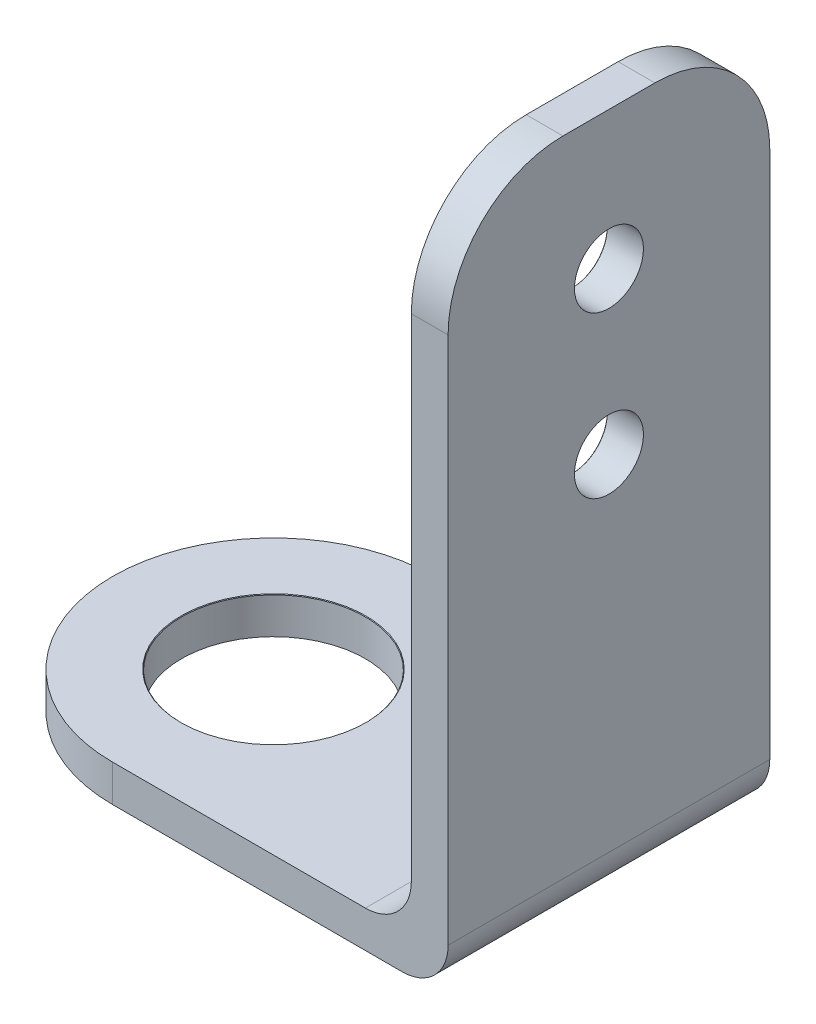
ISO-10303-21;
HEADER;
FILE_DESCRIPTION(('STEP AP214'),'2;1');
FILE_NAME('part.step','',(''),(''),'','','');
FILE_SCHEMA(('AUTOMOTIVE_DESIGN { 1 0 10303 214 1 1 1 1 }'));
ENDSEC;
DATA;
#1=APPLICATION_CONTEXT('core data for automotive mechanical design processes');
#2=APPLICATION_PROTOCOL_DEFINITION('international standard','automotive_design',2000,#1);
#3=PRODUCT_CONTEXT('',#1,'mechanical');
#4=PRODUCT('Part','Part','',(#3));
#5=PRODUCT_RELATED_PRODUCT_CATEGORY('part','',(#4));
#6=PRODUCT_DEFINITION_FORMATION('','',#4);
#7=PRODUCT_DEFINITION_CONTEXT('part definition',#1,'design');
#8=PRODUCT_DEFINITION('design','',#6,#7);
#9=PRODUCT_DEFINITION_SHAPE('','',#8);
#10=(LENGTH_UNIT() NAMED_UNIT(*) SI_UNIT(.MILLI.,.METRE.));
#11=(NAMED_UNIT(*) PLANE_ANGLE_UNIT() SI_UNIT($,.RADIAN.));
#12=(NAMED_UNIT(*) SI_UNIT($,.STERADIAN.) SOLID_ANGLE_UNIT());
#13=UNCERTAINTY_MEASURE_WITH_UNIT(LENGTH_MEASURE(1.E-05),#10,'distance_accuracy_value','');
#14=(GEOMETRIC_REPRESENTATION_CONTEXT(3) GLOBAL_UNCERTAINTY_ASSIGNED_CONTEXT((#13)) GLOBAL_UNIT_ASSIGNED_CONTEXT((#10,
#11,#12)) REPRESENTATION_CONTEXT('',''));
#15=CARTESIAN_POINT('',(0.,0.,0.));
#16=DIRECTION('',(0.,0.,1.));
#17=DIRECTION('',(1.,0.,0.));
#18=AXIS2_PLACEMENT_3D('',#15,#16,#17);
#19=CARTESIAN_POINT('',(7.,1.6,7.));
#20=DIRECTION('',(0.,-1.,0.));
#21=DIRECTION('',(1.,0.,0.));
#22=AXIS2_PLACEMENT_3D('',#19,#20,#21);
#23=CYLINDRICAL_SURFACE('',#22,7.);
#24=DIRECTION('',(0.,1.,0.));
#25=VECTOR('',#24,1.);
#26=CARTESIAN_POINT('',(7.,1.6,14.));
#27=LINE('',#26,#25);
#28=CARTESIAN_POINT('',(7.,1.6,14.));
#29=VERTEX_POINT('',#28);
#30=CARTESIAN_POINT('',(7.,0.,14.));
#31=VERTEX_POINT('',#30);
#32=EDGE_CURVE('E122',#29,#31,#27,.F.);
#33=ORIENTED_EDGE('',*,*,#32,.F.);
#34=CARTESIAN_POINT('',(7.,1.6,7.));
#35=DIRECTION('',(0.,-1.,0.));
#36=DIRECTION('',(1.,0.,0.));
#37=AXIS2_PLACEMENT_3D('',#34,#35,#36);
#38=CIRCLE('',#37,7.);
#39=CARTESIAN_POINT('',(7.,1.6,0.));
#40=VERTEX_POINT('',#39);
#41=EDGE_CURVE('E127',#40,#29,#38,.F.);
#42=ORIENTED_EDGE('',*,*,#41,.F.);
#43=DIRECTION('',(0.,-1.,0.));
#44=VECTOR('',#43,1.);
#45=CARTESIAN_POINT('',(7.,0.,0.));
#46=LINE('',#45,#44);
#47=CARTESIAN_POINT('',(7.,0.,0.));
#48=VERTEX_POINT('',#47);
#49=EDGE_CURVE('E124',#48,#40,#46,.F.);
#50=ORIENTED_EDGE('',*,*,#49,.F.);
#51=CARTESIAN_POINT('',(7.,0.,7.));
#52=DIRECTION('',(0.,1.,0.));
#53=DIRECTION('',(0.,0.,1.));
#54=AXIS2_PLACEMENT_3D('',#51,#52,#53);
#55=CIRCLE('',#54,7.);
#56=EDGE_CURVE('E119',#31,#48,#55,.F.);
#57=ORIENTED_EDGE('',*,*,#56,.F.);
#58=EDGE_LOOP('',(#33,#42,#50,#57));
#59=FACE_BOUND('',#58,.T.);
#60=ADVANCED_FACE('F40',(#59),#23,.T.);
#61=CARTESIAN_POINT('',(0.,0.,14.));
#62=DIRECTION('',(0.,1.,0.));
#63=DIRECTION('',(0.,0.,1.));
#64=AXIS2_PLACEMENT_3D('',#61,#62,#63);
#65=PLANE('',#64);
#66=CARTESIAN_POINT('',(7.,0.,7.));
#67=DIRECTION('',(0.,1.,0.));
#68=DIRECTION('',(0.,0.,1.));
#69=AXIS2_PLACEMENT_3D('',#66,#67,#68);
#70=CIRCLE('',#69,3.99999999999999);
#71=CARTESIAN_POINT('',(7.,0.,11.));
#72=VERTEX_POINT('',#71);
#73=EDGE_CURVE('E164',#72,#72,#70,.T.);
#74=ORIENTED_EDGE('',*,*,#73,.T.);
#75=EDGE_LOOP('',(#74));
#76=FACE_BOUND('',#75,.T.);
#77=DIRECTION('',(1.,0.,0.));
#78=VECTOR('',#77,1.);
#79=CARTESIAN_POINT('',(0.,0.,0.));
#80=LINE('',#79,#78);
#81=CARTESIAN_POINT('',(19.6,0.,0.));
#82=VERTEX_POINT('',#81);
#83=EDGE_CURVE('E160',#48,#82,#80,.T.);
#84=ORIENTED_EDGE('',*,*,#83,.T.);
#85=DIRECTION('',(0.,0.,-1.));
#86=VECTOR('',#85,1.);
#87=CARTESIAN_POINT('',(19.6,0.,14.));
#88=LINE('',#87,#86);
#89=CARTESIAN_POINT('',(19.6,0.,14.));
#90=VERTEX_POINT('',#89);
#91=EDGE_CURVE('E56',#82,#90,#88,.F.);
#92=ORIENTED_EDGE('',*,*,#91,.T.);
#93=DIRECTION('',(1.,0.,0.));
#94=VECTOR('',#93,1.);
#95=CARTESIAN_POINT('',(0.,0.,14.));
#96=LINE('',#95,#94);
#97=EDGE_CURVE('E131',#31,#90,#96,.T.);
#98=ORIENTED_EDGE('',*,*,#97,.F.);
#99=ORIENTED_EDGE('',*,*,#56,.T.);
#100=EDGE_LOOP('',(#84,#92,#98,#99));
#101=FACE_BOUND('',#100,.T.);
#102=ADVANCED_FACE('F139',(#76,#101),#65,.F.);
#103=CARTESIAN_POINT('',(21.6,0.,14.));
#104=DIRECTION('',(-1.,0.,0.));
#105=DIRECTION('',(0.,0.,1.));
#106=AXIS2_PLACEMENT_3D('',#103,#104,#105);
#107=PLANE('',#106);
#108=CARTESIAN_POINT('',(21.6,24.,7.));
#109=DIRECTION('',(-1.,0.,0.));
#110=DIRECTION('',(0.,0.,1.));
#111=AXIS2_PLACEMENT_3D('',#108,#109,#110);
#112=CIRCLE('',#111,1.5);
#113=CARTESIAN_POINT('',(21.6,24.,8.5));
#114=VERTEX_POINT('',#113);
#115=EDGE_CURVE('E189',#114,#114,#112,.T.);
#116=ORIENTED_EDGE('',*,*,#115,.T.);
#117=EDGE_LOOP('',(#116));
#118=FACE_BOUND('',#117,.T.);
#119=CARTESIAN_POINT('',(21.6,17.,7.));
#120=DIRECTION('',(-1.,0.,0.));
#121=DIRECTION('',(0.,0.,1.));
#122=AXIS2_PLACEMENT_3D('',#119,#120,#121);
#123=CIRCLE('',#122,1.5);
#124=CARTESIAN_POINT('',(21.6,17.,8.5));
#125=VERTEX_POINT('',#124);
#126=EDGE_CURVE('E183',#125,#125,#123,.T.);
#127=ORIENTED_EDGE('',*,*,#126,.T.);
#128=EDGE_LOOP('',(#127));
#129=FACE_BOUND('',#128,.T.);
#130=DIRECTION('',(0.,1.,0.));
#131=VECTOR('',#130,1.);
#132=CARTESIAN_POINT('',(21.6,0.,14.));
#133=LINE('',#132,#131);
#134=CARTESIAN_POINT('',(21.6,2.,14.));
#135=VERTEX_POINT('',#134);
#136=CARTESIAN_POINT('',(21.6,25.,14.));
#137=VERTEX_POINT('',#136);
#138=EDGE_CURVE('E141',#135,#137,#133,.T.);
#139=ORIENTED_EDGE('',*,*,#138,.F.);
#140=DIRECTION('',(0.,0.,-1.));
#141=VECTOR('',#140,1.);
#142=CARTESIAN_POINT('',(21.6,2.,14.));
#143=LINE('',#142,#141);
#144=CARTESIAN_POINT('',(21.6,2.,0.));
#145=VERTEX_POINT('',#144);
#146=EDGE_CURVE('E229',#135,#145,#143,.T.);
#147=ORIENTED_EDGE('',*,*,#146,.T.);
#148=DIRECTION('',(0.,1.,0.));
#149=VECTOR('',#148,1.);
#150=CARTESIAN_POINT('',(21.6,0.,0.));
#151=LINE('',#150,#149);
#152=CARTESIAN_POINT('',(21.6,25.,0.));
#153=VERTEX_POINT('',#152);
#154=EDGE_CURVE('E163',#145,#153,#151,.T.);
#155=ORIENTED_EDGE('',*,*,#154,.T.);
#156=CARTESIAN_POINT('',(21.6,25.,5.));
#157=DIRECTION('',(-1.,0.,0.));
#158=DIRECTION('',(0.,0.,1.));
#159=AXIS2_PLACEMENT_3D('',#156,#157,#158);
#160=CIRCLE('',#159,5.);
#161=CARTESIAN_POINT('',(21.6,30.,5.));
#162=VERTEX_POINT('',#161);
#163=EDGE_CURVE('E215',#153,#162,#160,.F.);
#164=ORIENTED_EDGE('',*,*,#163,.T.);
#165=DIRECTION('',(0.,0.,-1.));
#166=VECTOR('',#165,1.);
#167=CARTESIAN_POINT('',(21.6,30.,14.));
#168=LINE('',#167,#166);
#169=CARTESIAN_POINT('',(21.6,30.,9.));
#170=VERTEX_POINT('',#169);
#171=EDGE_CURVE('E137',#170,#162,#168,.T.);
#172=ORIENTED_EDGE('',*,*,#171,.F.);
#173=CARTESIAN_POINT('',(21.6,25.,9.));
#174=DIRECTION('',(-1.,0.,0.));
#175=DIRECTION('',(0.,0.,1.));
#176=AXIS2_PLACEMENT_3D('',#173,#174,#175);
#177=CIRCLE('',#176,5.);
#178=EDGE_CURVE('E211',#170,#137,#177,.F.);
#179=ORIENTED_EDGE('',*,*,#178,.T.);
#180=EDGE_LOOP('',(#139,#147,#155,#164,#172,#179));
#181=FACE_BOUND('',#180,.T.);
#182=ADVANCED_FACE('F258',(#118,#129,#181),#107,.F.);
#183=CARTESIAN_POINT('',(21.6,30.,14.));
#184=DIRECTION('',(0.,-1.,0.));
#185=DIRECTION('',(0.,0.,-1.));
#186=AXIS2_PLACEMENT_3D('',#183,#184,#185);
#187=PLANE('',#186);
#188=ORIENTED_EDGE('',*,*,#171,.T.);
#189=DIRECTION('',(-1.,0.,0.));
#190=VECTOR('',#189,1.);
#191=CARTESIAN_POINT('',(21.6,30.,5.));
#192=LINE('',#191,#190);
#193=CARTESIAN_POINT('',(20.,30.,5.));
#194=VERTEX_POINT('',#193);
#195=EDGE_CURVE('E197',#162,#194,#192,.T.);
#196=ORIENTED_EDGE('',*,*,#195,.T.);
#197=DIRECTION('',(0.,0.,-1.));
#198=VECTOR('',#197,1.);
#199=CARTESIAN_POINT('',(20.,30.,14.));
#200=LINE('',#199,#198);
#201=CARTESIAN_POINT('',(20.,30.,9.));
#202=VERTEX_POINT('',#201);
#203=EDGE_CURVE('E159',#202,#194,#200,.T.);
#204=ORIENTED_EDGE('',*,*,#203,.F.);
#205=DIRECTION('',(-1.,0.,0.));
#206=VECTOR('',#205,1.);
#207=CARTESIAN_POINT('',(21.6,30.,9.));
#208=LINE('',#207,#206);
#209=EDGE_CURVE('E126',#202,#170,#208,.F.);
#210=ORIENTED_EDGE('',*,*,#209,.T.);
#211=EDGE_LOOP('',(#188,#196,#204,#210));
#212=FACE_BOUND('',#211,.T.);
#213=ADVANCED_FACE('F267',(#212),#187,.F.);
#214=CARTESIAN_POINT('',(20.,30.,14.));
#215=DIRECTION('',(1.,0.,0.));
#216=DIRECTION('',(0.,1.,0.));
#217=AXIS2_PLACEMENT_3D('',#214,#215,#216);
#218=PLANE('',#217);
#219=CARTESIAN_POINT('',(20.,24.,7.));
#220=DIRECTION('',(-1.,0.,0.));
#221=DIRECTION('',(0.,0.,1.));
#222=AXIS2_PLACEMENT_3D('',#219,#220,#221);
#223=CIRCLE('',#222,1.525);
#224=CARTESIAN_POINT('',(20.,24.,8.525));
#225=VERTEX_POINT('',#224);
#226=EDGE_CURVE('E338',#225,#225,#223,.T.);
#227=ORIENTED_EDGE('',*,*,#226,.F.);
#228=EDGE_LOOP('',(#227));
#229=FACE_BOUND('',#228,.T.);
#230=CARTESIAN_POINT('',(20.,17.,7.));
#231=DIRECTION('',(-1.,0.,0.));
#232=DIRECTION('',(0.,0.,1.));
#233=AXIS2_PLACEMENT_3D('',#230,#231,#232);
#234=CIRCLE('',#233,1.525);
#235=CARTESIAN_POINT('',(20.,17.,8.525));
#236=VERTEX_POINT('',#235);
#237=EDGE_CURVE('E193',#236,#236,#234,.T.);
#238=ORIENTED_EDGE('',*,*,#237,.F.);
#239=EDGE_LOOP('',(#238));
#240=FACE_BOUND('',#239,.T.);
#241=DIRECTION('',(0.,-1.,0.));
#242=VECTOR('',#241,1.);
#243=CARTESIAN_POINT('',(20.,30.,0.));
#244=LINE('',#243,#242);
#245=CARTESIAN_POINT('',(20.,25.,0.));
#246=VERTEX_POINT('',#245);
#247=CARTESIAN_POINT('',(20.,3.60000000000001,0.));
#248=VERTEX_POINT('',#247);
#249=EDGE_CURVE('E148',#246,#248,#244,.T.);
#250=ORIENTED_EDGE('',*,*,#249,.T.);
#251=DIRECTION('',(0.,0.,-1.));
#252=VECTOR('',#251,1.);
#253=CARTESIAN_POINT('',(20.,3.6,14.));
#254=LINE('',#253,#252);
#255=CARTESIAN_POINT('',(20.,3.60000000000001,14.));
#256=VERTEX_POINT('',#255);
#257=EDGE_CURVE('E226',#248,#256,#254,.F.);
#258=ORIENTED_EDGE('',*,*,#257,.T.);
#259=DIRECTION('',(0.,-1.,0.));
#260=VECTOR('',#259,1.);
#261=CARTESIAN_POINT('',(20.,30.,14.));
#262=LINE('',#261,#260);
#263=CARTESIAN_POINT('',(20.,25.,14.));
#264=VERTEX_POINT('',#263);
#265=EDGE_CURVE('E146',#264,#256,#262,.T.);
#266=ORIENTED_EDGE('',*,*,#265,.F.);
#267=CARTESIAN_POINT('',(20.,25.,9.));
#268=DIRECTION('',(1.,0.,0.));
#269=DIRECTION('',(0.,1.,0.));
#270=AXIS2_PLACEMENT_3D('',#267,#268,#269);
#271=CIRCLE('',#270,5.);
#272=EDGE_CURVE('E201',#264,#202,#271,.F.);
#273=ORIENTED_EDGE('',*,*,#272,.T.);
#274=ORIENTED_EDGE('',*,*,#203,.T.);
#275=CARTESIAN_POINT('',(20.,25.,5.));
#276=DIRECTION('',(1.,0.,0.));
#277=DIRECTION('',(0.,1.,0.));
#278=AXIS2_PLACEMENT_3D('',#275,#276,#277);
#279=CIRCLE('',#278,5.);
#280=EDGE_CURVE('E204',#194,#246,#279,.F.);
#281=ORIENTED_EDGE('',*,*,#280,.T.);
#282=EDGE_LOOP('',(#250,#258,#266,#273,#274,#281));
#283=FACE_BOUND('',#282,.T.);
#284=ADVANCED_FACE('F248',(#229,#240,#283),#218,.F.);
#285=CARTESIAN_POINT('',(20.,1.6,14.));
#286=DIRECTION('',(0.,-1.,0.));
#287=DIRECTION('',(1.,0.,0.));
#288=AXIS2_PLACEMENT_3D('',#285,#286,#287);
#289=PLANE('',#288);
#290=CARTESIAN_POINT('',(7.,1.6,7.));
#291=DIRECTION('',(0.,1.,0.));
#292=DIRECTION('',(0.,0.,1.));
#293=AXIS2_PLACEMENT_3D('',#290,#291,#292);
#294=CIRCLE('',#293,4.025);
#295=CARTESIAN_POINT('',(7.,1.6,11.025));
#296=VERTEX_POINT('',#295);
#297=EDGE_CURVE('E187',#296,#296,#294,.T.);
#298=ORIENTED_EDGE('',*,*,#297,.F.);
#299=EDGE_LOOP('',(#298));
#300=FACE_BOUND('',#299,.T.);
#301=DIRECTION('',(-1.,0.,0.));
#302=VECTOR('',#301,1.);
#303=CARTESIAN_POINT('',(20.,1.6,14.));
#304=LINE('',#303,#302);
#305=CARTESIAN_POINT('',(18.,1.6,14.));
#306=VERTEX_POINT('',#305);
#307=EDGE_CURVE('E134',#306,#29,#304,.T.);
#308=ORIENTED_EDGE('',*,*,#307,.F.);
#309=DIRECTION('',(0.,0.,-1.));
#310=VECTOR('',#309,1.);
#311=CARTESIAN_POINT('',(18.,1.6,0.));
#312=LINE('',#311,#310);
#313=CARTESIAN_POINT('',(18.,1.6,0.));
#314=VERTEX_POINT('',#313);
#315=EDGE_CURVE('E222',#306,#314,#312,.T.);
#316=ORIENTED_EDGE('',*,*,#315,.T.);
#317=DIRECTION('',(-1.,0.,0.));
#318=VECTOR('',#317,1.);
#319=CARTESIAN_POINT('',(20.,1.6,0.));
#320=LINE('',#319,#318);
#321=EDGE_CURVE('E142',#314,#40,#320,.T.);
#322=ORIENTED_EDGE('',*,*,#321,.T.);
#323=ORIENTED_EDGE('',*,*,#41,.T.);
#324=EDGE_LOOP('',(#308,#316,#322,#323));
#325=FACE_BOUND('',#324,.T.);
#326=ADVANCED_FACE('F253',(#300,#325),#289,.F.);
#327=CARTESIAN_POINT('',(0.,0.,14.));
#328=DIRECTION('',(0.,0.,1.));
#329=DIRECTION('',(1.,0.,0.));
#330=AXIS2_PLACEMENT_3D('',#327,#328,#329);
#331=PLANE('',#330);
#332=ORIENTED_EDGE('',*,*,#97,.T.);
#333=CARTESIAN_POINT('',(19.6,2.,14.));
#334=DIRECTION('',(0.,0.,1.));
#335=DIRECTION('',(1.,0.,0.));
#336=AXIS2_PLACEMENT_3D('',#333,#334,#335);
#337=CIRCLE('',#336,2.);
#338=EDGE_CURVE('E237',#90,#135,#337,.T.);
#339=ORIENTED_EDGE('',*,*,#338,.T.);
#340=ORIENTED_EDGE('',*,*,#138,.T.);
#341=DIRECTION('',(-1.,0.,0.));
#342=VECTOR('',#341,1.);
#343=CARTESIAN_POINT('',(20.,25.,14.));
#344=LINE('',#343,#342);
#345=EDGE_CURVE('E218',#137,#264,#344,.T.);
#346=ORIENTED_EDGE('',*,*,#345,.T.);
#347=ORIENTED_EDGE('',*,*,#265,.T.);
#348=CARTESIAN_POINT('',(18.,3.6,14.));
#349=DIRECTION('',(0.,0.,1.));
#350=DIRECTION('',(1.,0.,0.));
#351=AXIS2_PLACEMENT_3D('',#348,#349,#350);
#352=CIRCLE('',#351,2.);
#353=EDGE_CURVE('E11',#256,#306,#352,.F.);
#354=ORIENTED_EDGE('',*,*,#353,.T.);
#355=ORIENTED_EDGE('',*,*,#307,.T.);
#356=ORIENTED_EDGE('',*,*,#32,.T.);
#357=EDGE_LOOP('',(#332,#339,#340,#346,#347,#354,#355,#356));
#358=FACE_BOUND('',#357,.T.);
#359=ADVANCED_FACE('F130',(#358),#331,.T.);
#360=CARTESIAN_POINT('',(0.,0.,0.));
#361=DIRECTION('',(0.,0.,1.));
#362=DIRECTION('',(1.,0.,0.));
#363=AXIS2_PLACEMENT_3D('',#360,#361,#362);
#364=PLANE('',#363);
#365=ORIENTED_EDGE('',*,*,#154,.F.);
#366=CARTESIAN_POINT('',(19.6,2.,0.));
#367=DIRECTION('',(0.,0.,1.));
#368=DIRECTION('',(1.,0.,0.));
#369=AXIS2_PLACEMENT_3D('',#366,#367,#368);
#370=CIRCLE('',#369,2.);
#371=EDGE_CURVE('E64',#145,#82,#370,.F.);
#372=ORIENTED_EDGE('',*,*,#371,.T.);
#373=ORIENTED_EDGE('',*,*,#83,.F.);
#374=ORIENTED_EDGE('',*,*,#49,.T.);
#375=ORIENTED_EDGE('',*,*,#321,.F.);
#376=CARTESIAN_POINT('',(18.,3.6,0.));
#377=DIRECTION('',(0.,0.,1.));
#378=DIRECTION('',(1.,0.,0.));
#379=AXIS2_PLACEMENT_3D('',#376,#377,#378);
#380=CIRCLE('',#379,2.);
#381=EDGE_CURVE('E49',#314,#248,#380,.T.);
#382=ORIENTED_EDGE('',*,*,#381,.T.);
#383=ORIENTED_EDGE('',*,*,#249,.F.);
#384=DIRECTION('',(-1.,0.,0.));
#385=VECTOR('',#384,1.);
#386=CARTESIAN_POINT('',(0.,25.,0.));
#387=LINE('',#386,#385);
#388=EDGE_CURVE('E207',#246,#153,#387,.F.);
#389=ORIENTED_EDGE('',*,*,#388,.T.);
#390=EDGE_LOOP('',(#365,#372,#373,#374,#375,#382,#383,#389));
#391=FACE_BOUND('',#390,.T.);
#392=ADVANCED_FACE('F242',(#391),#364,.F.);
#393=CARTESIAN_POINT('',(7.,1.6,7.));
#394=DIRECTION('',(0.,1.,0.));
#395=DIRECTION('',(0.,0.,1.));
#396=AXIS2_PLACEMENT_3D('',#393,#394,#395);
#397=CYLINDRICAL_SURFACE('',#396,3.99999999999999);
#398=CARTESIAN_POINT('',(7.,1.57499999999999,7.));
#399=DIRECTION('',(0.,1.,0.));
#400=DIRECTION('',(0.,0.,1.));
#401=AXIS2_PLACEMENT_3D('',#398,#399,#400);
#402=CIRCLE('',#401,3.99999999999999);
#403=CARTESIAN_POINT('',(7.,1.57499999999999,11.));
#404=VERTEX_POINT('',#403);
#405=EDGE_CURVE('E151',#404,#404,#402,.T.);
#406=ORIENTED_EDGE('',*,*,#405,.T.);
#407=EDGE_LOOP('',(#406));
#408=FACE_BOUND('',#407,.T.);
#409=ORIENTED_EDGE('',*,*,#73,.F.);
#410=EDGE_LOOP('',(#409));
#411=FACE_BOUND('',#410,.T.);
#412=ADVANCED_FACE('F308',(#408,#411),#397,.F.);
#413=CARTESIAN_POINT('',(7.,1.6,7.));
#414=DIRECTION('',(0.,1.,0.));
#415=DIRECTION('',(0.,0.,1.));
#416=AXIS2_PLACEMENT_3D('',#413,#414,#415);
#417=CONICAL_SURFACE('',#416,4.025,0.785398163397448);
#418=ORIENTED_EDGE('',*,*,#405,.F.);
#419=EDGE_LOOP('',(#418));
#420=FACE_BOUND('',#419,.T.);
#421=ORIENTED_EDGE('',*,*,#297,.T.);
#422=EDGE_LOOP('',(#421));
#423=FACE_BOUND('',#422,.T.);
#424=ADVANCED_FACE('F313',(#420,#423),#417,.F.);
#425=CARTESIAN_POINT('',(20.,17.,7.));
#426=DIRECTION('',(-1.,0.,0.));
#427=DIRECTION('',(0.,0.,1.));
#428=AXIS2_PLACEMENT_3D('',#425,#426,#427);
#429=CYLINDRICAL_SURFACE('',#428,1.5);
#430=CARTESIAN_POINT('',(20.025,17.,7.));
#431=DIRECTION('',(-1.,0.,0.));
#432=DIRECTION('',(0.,0.,1.));
#433=AXIS2_PLACEMENT_3D('',#430,#431,#432);
#434=CIRCLE('',#433,1.5);
#435=CARTESIAN_POINT('',(20.025,17.,8.5));
#436=VERTEX_POINT('',#435);
#437=EDGE_CURVE('E188',#436,#436,#434,.T.);
#438=ORIENTED_EDGE('',*,*,#437,.T.);
#439=EDGE_LOOP('',(#438));
#440=FACE_BOUND('',#439,.T.);
#441=ORIENTED_EDGE('',*,*,#126,.F.);
#442=EDGE_LOOP('',(#441));
#443=FACE_BOUND('',#442,.T.);
#444=ADVANCED_FACE('F317',(#440,#443),#429,.F.);
#445=CARTESIAN_POINT('',(20.,17.,7.));
#446=DIRECTION('',(-1.,0.,0.));
#447=DIRECTION('',(0.,0.,1.));
#448=AXIS2_PLACEMENT_3D('',#445,#446,#447);
#449=CONICAL_SURFACE('',#448,1.525,0.785398163397448);
#450=ORIENTED_EDGE('',*,*,#437,.F.);
#451=EDGE_LOOP('',(#450));
#452=FACE_BOUND('',#451,.T.);
#453=ORIENTED_EDGE('',*,*,#237,.T.);
#454=EDGE_LOOP('',(#453));
#455=FACE_BOUND('',#454,.T.);
#456=ADVANCED_FACE('F321',(#452,#455),#449,.F.);
#457=CARTESIAN_POINT('',(20.,24.,7.));
#458=DIRECTION('',(-1.,0.,0.));
#459=DIRECTION('',(0.,0.,1.));
#460=AXIS2_PLACEMENT_3D('',#457,#458,#459);
#461=CYLINDRICAL_SURFACE('',#460,1.5);
#462=CARTESIAN_POINT('',(20.025,24.,7.));
#463=DIRECTION('',(-1.,0.,0.));
#464=DIRECTION('',(0.,0.,1.));
#465=AXIS2_PLACEMENT_3D('',#462,#463,#464);
#466=CIRCLE('',#465,1.5);
#467=CARTESIAN_POINT('',(20.025,24.,8.5));
#468=VERTEX_POINT('',#467);
#469=EDGE_CURVE('E194',#468,#468,#466,.T.);
#470=ORIENTED_EDGE('',*,*,#469,.T.);
#471=EDGE_LOOP('',(#470));
#472=FACE_BOUND('',#471,.T.);
#473=ORIENTED_EDGE('',*,*,#115,.F.);
#474=EDGE_LOOP('',(#473));
#475=FACE_BOUND('',#474,.T.);
#476=ADVANCED_FACE('F280',(#472,#475),#461,.F.);
#477=CARTESIAN_POINT('',(20.,24.,7.));
#478=DIRECTION('',(-1.,0.,0.));
#479=DIRECTION('',(0.,0.,1.));
#480=AXIS2_PLACEMENT_3D('',#477,#478,#479);
#481=CONICAL_SURFACE('',#480,1.525,0.785398163397448);
#482=ORIENTED_EDGE('',*,*,#469,.F.);
#483=EDGE_LOOP('',(#482));
#484=FACE_BOUND('',#483,.T.);
#485=ORIENTED_EDGE('',*,*,#226,.T.);
#486=EDGE_LOOP('',(#485));
#487=FACE_BOUND('',#486,.T.);
#488=ADVANCED_FACE('F273',(#484,#487),#481,.F.);
#489=CARTESIAN_POINT('',(21.6,25.,5.));
#490=DIRECTION('',(-1.,0.,0.));
#491=DIRECTION('',(0.,0.,1.));
#492=AXIS2_PLACEMENT_3D('',#489,#490,#491);
#493=CYLINDRICAL_SURFACE('',#492,5.);
#494=ORIENTED_EDGE('',*,*,#163,.F.);
#495=ORIENTED_EDGE('',*,*,#388,.F.);
#496=ORIENTED_EDGE('',*,*,#280,.F.);
#497=ORIENTED_EDGE('',*,*,#195,.F.);
#498=EDGE_LOOP('',(#494,#495,#496,#497));
#499=FACE_BOUND('',#498,.T.);
#500=ADVANCED_FACE('F271',(#499),#493,.T.);
#501=CARTESIAN_POINT('',(0.,25.,9.));
#502=DIRECTION('',(1.,0.,0.));
#503=DIRECTION('',(0.,0.,-1.));
#504=AXIS2_PLACEMENT_3D('',#501,#502,#503);
#505=CYLINDRICAL_SURFACE('',#504,5.);
#506=ORIENTED_EDGE('',*,*,#178,.F.);
#507=ORIENTED_EDGE('',*,*,#209,.F.);
#508=ORIENTED_EDGE('',*,*,#272,.F.);
#509=ORIENTED_EDGE('',*,*,#345,.F.);
#510=EDGE_LOOP('',(#506,#507,#508,#509));
#511=FACE_BOUND('',#510,.T.);
#512=ADVANCED_FACE('F264',(#511),#505,.T.);
#513=CARTESIAN_POINT('',(18.,3.6,14.));
#514=DIRECTION('',(0.,0.,1.));
#515=DIRECTION('',(1.,0.,0.));
#516=AXIS2_PLACEMENT_3D('',#513,#514,#515);
#517=CYLINDRICAL_SURFACE('',#516,2.);
#518=ORIENTED_EDGE('',*,*,#353,.F.);
#519=ORIENTED_EDGE('',*,*,#257,.F.);
#520=ORIENTED_EDGE('',*,*,#381,.F.);
#521=ORIENTED_EDGE('',*,*,#315,.F.);
#522=EDGE_LOOP('',(#518,#519,#520,#521));
#523=FACE_BOUND('',#522,.T.);
#524=ADVANCED_FACE('F251',(#523),#517,.F.);
#525=CARTESIAN_POINT('',(19.6,2.,14.));
#526=DIRECTION('',(0.,0.,-1.));
#527=DIRECTION('',(-1.,0.,0.));
#528=AXIS2_PLACEMENT_3D('',#525,#526,#527);
#529=CYLINDRICAL_SURFACE('',#528,2.);
#530=ORIENTED_EDGE('',*,*,#338,.F.);
#531=ORIENTED_EDGE('',*,*,#91,.F.);
#532=ORIENTED_EDGE('',*,*,#371,.F.);
#533=ORIENTED_EDGE('',*,*,#146,.F.);
#534=EDGE_LOOP('',(#530,#531,#532,#533));
#535=FACE_BOUND('',#534,.T.);
#536=ADVANCED_FACE('F42',(#535),#529,.T.);
#537=CLOSED_SHELL('',(#60,#102,#182,#213,#284,#326,#359,#392,#412,#424,#444,#456,#476,#488,#500,
#512,#524,#536));
#538=MANIFOLD_SOLID_BREP('B2',#537);
#539=ADVANCED_BREP_SHAPE_REPRESENTATION('',(#18,#538),#14);
#540=SHAPE_DEFINITION_REPRESENTATION(#9,#539);
ENDSEC;
END-ISO-10303-21;
